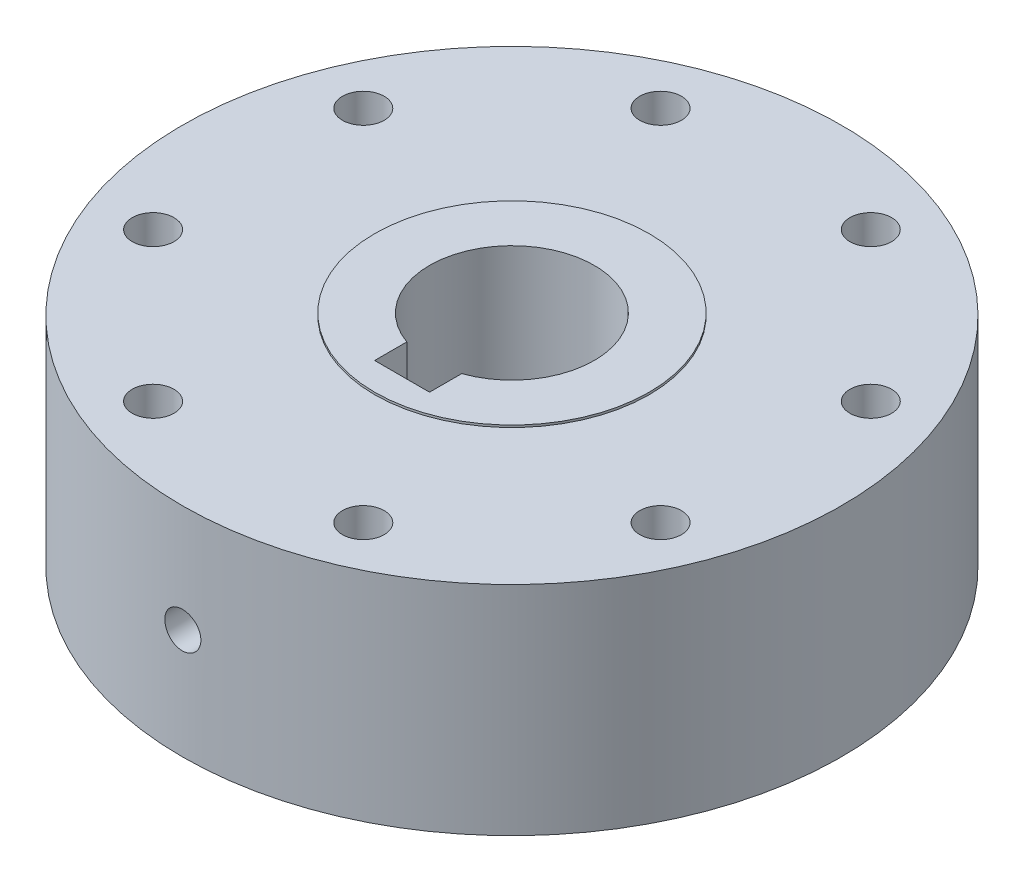
ISO-10303-21;
HEADER;
FILE_DESCRIPTION(('STEP AP214'),'2;1');
FILE_NAME('part.step','',(''),(''),'','','');
FILE_SCHEMA(('AUTOMOTIVE_DESIGN { 1 0 10303 214 1 1 1 1 }'));
ENDSEC;
DATA;
#1=APPLICATION_CONTEXT('core data for automotive mechanical design processes');
#2=APPLICATION_PROTOCOL_DEFINITION('international standard','automotive_design',2000,#1);
#3=PRODUCT_CONTEXT('',#1,'mechanical');
#4=PRODUCT('Part','Part','',(#3));
#5=PRODUCT_RELATED_PRODUCT_CATEGORY('part','',(#4));
#6=PRODUCT_DEFINITION_FORMATION('','',#4);
#7=PRODUCT_DEFINITION_CONTEXT('part definition',#1,'design');
#8=PRODUCT_DEFINITION('design','',#6,#7);
#9=PRODUCT_DEFINITION_SHAPE('','',#8);
#10=(LENGTH_UNIT() NAMED_UNIT(*) SI_UNIT(.MILLI.,.METRE.));
#11=(NAMED_UNIT(*) PLANE_ANGLE_UNIT() SI_UNIT($,.RADIAN.));
#12=(NAMED_UNIT(*) SI_UNIT($,.STERADIAN.) SOLID_ANGLE_UNIT());
#13=UNCERTAINTY_MEASURE_WITH_UNIT(LENGTH_MEASURE(1.E-05),#10,'distance_accuracy_value','');
#14=(GEOMETRIC_REPRESENTATION_CONTEXT(3) GLOBAL_UNCERTAINTY_ASSIGNED_CONTEXT((#13)) GLOBAL_UNIT_ASSIGNED_CONTEXT((#10,
#11,#12)) REPRESENTATION_CONTEXT('',''));
#15=CARTESIAN_POINT('',(0.,0.,0.));
#16=DIRECTION('',(0.,0.,1.));
#17=DIRECTION('',(1.,0.,0.));
#18=AXIS2_PLACEMENT_3D('',#15,#16,#17);
#19=CARTESIAN_POINT('',(0.,25.4,0.));
#20=DIRECTION('',(0.,1.,0.));
#21=DIRECTION('',(0.,0.,1.));
#22=AXIS2_PLACEMENT_3D('',#19,#20,#21);
#23=PLANE('',#22);
#24=DIRECTION('',(0.,0.,-1.));
#25=VECTOR('',#24,1.);
#26=CARTESIAN_POINT('',(3.175,25.4,12.7));
#27=LINE('',#26,#25);
#28=CARTESIAN_POINT('',(3.175,25.4,12.7));
#29=VERTEX_POINT('',#28);
#30=CARTESIAN_POINT('',(3.175,25.4,8.98025612106915));
#31=VERTEX_POINT('',#30);
#32=EDGE_CURVE('E98',#29,#31,#27,.T.);
#33=ORIENTED_EDGE('',*,*,#32,.F.);
#34=DIRECTION('',(1.,0.,0.));
#35=VECTOR('',#34,1.);
#36=CARTESIAN_POINT('',(-3.175,25.4,12.7));
#37=LINE('',#36,#35);
#38=CARTESIAN_POINT('',(-3.175,25.4,12.7));
#39=VERTEX_POINT('',#38);
#40=EDGE_CURVE('E94',#39,#29,#37,.T.);
#41=ORIENTED_EDGE('',*,*,#40,.F.);
#42=DIRECTION('',(0.,0.,1.));
#43=VECTOR('',#42,1.);
#44=CARTESIAN_POINT('',(-3.175,25.4,12.7));
#45=LINE('',#44,#43);
#46=CARTESIAN_POINT('',(-3.175,25.4,8.98025612106915));
#47=VERTEX_POINT('',#46);
#48=EDGE_CURVE('E77',#47,#39,#45,.T.);
#49=ORIENTED_EDGE('',*,*,#48,.F.);
#50=CARTESIAN_POINT('',(0.,25.4,0.));
#51=DIRECTION('',(0.,1.,0.));
#52=DIRECTION('',(0.,0.,1.));
#53=AXIS2_PLACEMENT_3D('',#50,#51,#52);
#54=CIRCLE('',#53,9.525);
#55=EDGE_CURVE('E128',#31,#47,#54,.T.);
#56=ORIENTED_EDGE('',*,*,#55,.F.);
#57=EDGE_LOOP('',(#33,#41,#49,#56));
#58=FACE_BOUND('',#57,.T.);
#59=CARTESIAN_POINT('',(0.,25.4,0.));
#60=DIRECTION('',(0.,1.,0.));
#61=DIRECTION('',(0.,0.,1.));
#62=AXIS2_PLACEMENT_3D('',#59,#60,#61);
#63=CIRCLE('',#62,15.875);
#64=CARTESIAN_POINT('',(0.,25.4,15.875));
#65=VERTEX_POINT('',#64);
#66=EDGE_CURVE('E248',#65,#65,#63,.T.);
#67=ORIENTED_EDGE('',*,*,#66,.T.);
#68=EDGE_LOOP('',(#67));
#69=FACE_BOUND('',#68,.T.);
#70=ADVANCED_FACE('F32',(#58,#69),#23,.T.);
#71=CARTESIAN_POINT('',(0.,25.4,0.));
#72=DIRECTION('',(0.,-1.,0.));
#73=DIRECTION('',(0.,0.,-1.));
#74=AXIS2_PLACEMENT_3D('',#71,#72,#73);
#75=CYLINDRICAL_SURFACE('',#74,38.1);
#76=CARTESIAN_POINT('',(0.,0.,0.));
#77=DIRECTION('',(0.,1.,0.));
#78=DIRECTION('',(0.,0.,1.));
#79=AXIS2_PLACEMENT_3D('',#76,#77,#78);
#80=CIRCLE('',#79,38.1);
#81=CARTESIAN_POINT('',(0.,0.,38.1));
#82=VERTEX_POINT('',#81);
#83=EDGE_CURVE('E131',#82,#82,#80,.T.);
#84=ORIENTED_EDGE('',*,*,#83,.T.);
#85=EDGE_LOOP('',(#84));
#86=FACE_BOUND('',#85,.T.);
#87=CARTESIAN_POINT('',(0.,10.6172,38.1));
#88=CARTESIAN_POINT('',(-0.116898118149773,10.6172051537948,38.0999992400124));
#89=CARTESIAN_POINT('',(-0.233878772564627,10.627074501162,38.099456242113));
#90=CARTESIAN_POINT('',(-0.464611950861902,10.666304732032,38.0973423179392));
#91=CARTESIAN_POINT('',(-0.578360523843941,10.6956884841257,38.0957701856712));
#92=CARTESIAN_POINT('',(-0.799253826201197,10.7731027867029,38.0917759009691));
#93=CARTESIAN_POINT('',(-0.906401929169276,10.8211237182805,38.0893541870776));
#94=CARTESIAN_POINT('',(-1.11108787034202,10.9344341751007,38.0839333545671));
#95=CARTESIAN_POINT('',(-1.20862794632376,10.9997196661917,38.0809343708812));
#96=CARTESIAN_POINT('',(-1.391472770554,11.1457911826273,38.0746923175143));
#97=CARTESIAN_POINT('',(-1.47676474441943,11.2265931889115,38.0714489982957));
#98=CARTESIAN_POINT('',(-1.63258321631064,11.4013717068467,38.0650859588253));
#99=CARTESIAN_POINT('',(-1.70310910642295,11.4953487606431,38.0619662436665));
#100=CARTESIAN_POINT('',(-1.82743045575922,11.6938790293206,38.0562003817822));
#101=CARTESIAN_POINT('',(-1.8812156641911,11.7984386725024,38.0535545256332));
#102=CARTESIAN_POINT('',(-1.97046319913224,12.0151208798816,38.0490378740331));
#103=CARTESIAN_POINT('',(-2.00592568479329,12.1272433783782,38.0471670718499));
#104=CARTESIAN_POINT('',(-2.05748663440265,12.3557486073612,38.0444138048177));
#105=CARTESIAN_POINT('',(-2.07360460436711,12.472126924235,38.0435303444459));
#106=CARTESIAN_POINT('',(-2.08607918802055,12.7059404117632,38.0428484021492));
#107=CARTESIAN_POINT('',(-2.08243598121361,12.823375572808,38.0430499103688));
#108=CARTESIAN_POINT('',(-2.05550785194473,13.0558364981857,38.0445142564687));
#109=CARTESIAN_POINT('',(-2.0322440154794,13.1708647132801,38.045775954973));
#110=CARTESIAN_POINT('',(-1.96676768902335,13.3953808643113,38.0492166884768));
#111=CARTESIAN_POINT('',(-1.92455510731288,13.5048687734279,38.0513957279165));
#112=CARTESIAN_POINT('',(-1.82235551875702,13.7152642229058,38.0564268709915));
#113=CARTESIAN_POINT('',(-1.76235891526367,13.8161670926582,38.0592793378533));
#114=CARTESIAN_POINT('',(-1.62630134311532,14.0064771266375,38.065335483282));
#115=CARTESIAN_POINT('',(-1.55024023772209,14.0958841930038,38.0685391648382));
#116=CARTESIAN_POINT('',(-1.38409384640786,14.2607873927191,38.0749417343897));
#117=CARTESIAN_POINT('',(-1.2939903047485,14.3362651343858,38.0781406105937));
#118=CARTESIAN_POINT('',(-1.10238085157414,14.4710253787851,38.0841690004455));
#119=CARTESIAN_POINT('',(-1.00087493688089,14.5303078770035,38.0869985139904));
#120=CARTESIAN_POINT('',(-0.789331219871679,14.6309931314684,38.0919694621865));
#121=CARTESIAN_POINT('',(-0.679293102396213,14.6723952268835,38.0941108714058));
#122=CARTESIAN_POINT('',(-0.453813402084093,14.7361323094456,38.0974639229982));
#123=CARTESIAN_POINT('',(-0.338371867574146,14.7584674670878,38.0986755736851));
#124=CARTESIAN_POINT('',(-0.105521925810008,14.7834139511654,38.1000314910098));
#125=CARTESIAN_POINT('',(0.0118837487628547,14.7860507129094,38.1001771341115));
#126=CARTESIAN_POINT('',(0.245469586830884,14.771591963014,38.0993882797459));
#127=CARTESIAN_POINT('',(0.361649755183604,14.7544965296169,38.0984537865614));
#128=CARTESIAN_POINT('',(0.589415248067528,14.7010797209736,38.0956107811925));
#129=CARTESIAN_POINT('',(0.7010033088576,14.6647699789403,38.0937028583916));
#130=CARTESIAN_POINT('',(0.916501359300316,14.5739670540551,38.0891277443874));
#131=CARTESIAN_POINT('',(1.02041129606856,14.5194737459749,38.0864605479551));
#132=CARTESIAN_POINT('',(1.21772015934398,14.3937855616492,38.0806633811317));
#133=CARTESIAN_POINT('',(1.31110822444127,14.3225736568805,38.0775329401184));
#134=CARTESIAN_POINT('',(1.48461314651072,14.1654945703459,38.071163319405));
#135=CARTESIAN_POINT('',(1.56472990257253,14.0796272771558,38.0679241388783));
#136=CARTESIAN_POINT('',(1.70950380349887,13.8955653395205,38.0616981751594));
#137=CARTESIAN_POINT('',(1.77414447616965,13.7973577284593,38.0587116630647));
#138=CARTESIAN_POINT('',(1.88601868736061,13.591468301222,38.0533320989587));
#139=CARTESIAN_POINT('',(1.93325231266649,13.4837865322843,38.0509390439885));
#140=CARTESIAN_POINT('',(2.0089429857058,13.2620662062661,38.0470181967842));
#141=CARTESIAN_POINT('',(2.03741048796101,13.148031226999,38.0454899228519));
#142=CARTESIAN_POINT('',(2.07479500277478,12.9167915779391,38.0434696312403));
#143=CARTESIAN_POINT('',(2.08371215510771,12.7995869308138,38.0429776061525));
#144=CARTESIAN_POINT('',(2.08174152727799,12.5654988462133,38.0430854778397));
#145=CARTESIAN_POINT('',(2.07087965366585,12.4486151891047,38.0436839462878));
#146=CARTESIAN_POINT('',(2.02971291184319,12.2183336723707,38.0459023361355));
#147=CARTESIAN_POINT('',(1.99940800715734,12.1049358192851,38.0475222594514));
#148=CARTESIAN_POINT('',(1.9202209558279,11.8848400309683,38.0516006579152));
#149=CARTESIAN_POINT('',(1.87133875413619,11.7781421155914,38.054059135548));
#150=CARTESIAN_POINT('',(1.75638876170778,11.5744652911815,38.0595375019407));
#151=CARTESIAN_POINT('',(1.69032146966757,11.4774861002326,38.0625573744086));
#152=CARTESIAN_POINT('',(1.54278254654911,11.2958693098962,38.0688227417525));
#153=CARTESIAN_POINT('',(1.4612925525256,11.2112466376974,38.0720685026381));
#154=CARTESIAN_POINT('',(1.2852392757015,11.0568551716993,38.078417791992));
#155=CARTESIAN_POINT('',(1.19067278782961,10.9870900301878,38.0815212853413));
#156=CARTESIAN_POINT('',(0.991065148848849,10.8643549169273,38.0872388435513));
#157=CARTESIAN_POINT('',(0.886013058533933,10.8114027313305,38.0898523889152));
#158=CARTESIAN_POINT('',(0.668573031737085,10.7239516831121,38.094288101125));
#159=CARTESIAN_POINT('',(0.556193910695684,10.689431088203,38.0961111994905));
#160=CARTESIAN_POINT('',(0.369266875454724,10.6488492898099,38.0982799332671));
#161=CARTESIAN_POINT('',(0.295928881894317,10.6369960259283,38.0989221125005));
#162=CARTESIAN_POINT('',(0.14840501519777,10.6211697490097,38.0997823869077));
#163=CARTESIAN_POINT('',(0.0742191429375544,10.6171967278324,38.1000004825196));
#164=CARTESIAN_POINT('',(0.,10.6172,38.1));
#165=B_SPLINE_CURVE_WITH_KNOTS('',3,(#87,#88,#89,#90,#91,#92,#93,#94,#95,#96,#97,#98,#99,#100,
#101,#102,#103,#104,#105,#106,#107,#108,#109,#110,#111,#112,#113,#114,#115,#116,#117,#118,#119,
#120,#121,#122,#123,#124,#125,#126,#127,#128,#129,#130,#131,#132,#133,#134,#135,#136,#137,#138,
#139,#140,#141,#142,#143,#144,#145,#146,#147,#148,#149,#150,#151,#152,#153,#154,#155,#156,#157,
#158,#159,#160,#161,#162,#163,#164),.UNSPECIFIED.,.T.,.F.,(4,2,2,2,2,2,2,2,2,2,2,2,2,2,2,2,2,2,
2,2,2,2,2,2,2,2,2,2,2,2,2,2,2,2,2,2,2,2,4),(0.,0.350423421243044,0.701258223926899,
1.0519121962006,1.40248430462873,1.75341943365593,2.10436900769498,2.45553305721007,
2.80669405645099,3.15750066467697,3.50830408629559,3.85873098441888,4.20915957877139,
4.55977761739735,4.91039864054291,5.26147934726456,5.61256015184473,5.96365393070692,
6.31474457008076,6.66538178954947,7.01601761867076,7.36644139945373,7.71686759361586,
8.06765227055999,8.41843961462447,8.76959868075505,9.1207559961006,9.47171751760667,
9.82267652992056,10.1731761870388,10.5236765016999,10.874177854969,11.224669038126,
11.5755801871279,11.9265774980185,12.2779448955653,12.6288970834253,12.8513827253459,
13.0738681374428),.UNSPECIFIED.);
#166=CARTESIAN_POINT('',(0.,10.6172,38.1));
#167=VERTEX_POINT('',#166);
#168=EDGE_CURVE('E12',#167,#167,#165,.T.);
#169=ORIENTED_EDGE('',*,*,#168,.T.);
#170=EDGE_LOOP('',(#169));
#171=FACE_BOUND('',#170,.T.);
#172=CARTESIAN_POINT('',(0.,25.146,0.));
#173=DIRECTION('',(0.,1.,0.));
#174=DIRECTION('',(0.,0.,1.));
#175=AXIS2_PLACEMENT_3D('',#172,#173,#174);
#176=CIRCLE('',#175,38.1);
#177=CARTESIAN_POINT('',(0.,25.146,38.1));
#178=VERTEX_POINT('',#177);
#179=EDGE_CURVE('E222',#178,#178,#176,.T.);
#180=ORIENTED_EDGE('',*,*,#179,.F.);
#181=EDGE_LOOP('',(#180));
#182=FACE_BOUND('',#181,.T.);
#183=ADVANCED_FACE('F34',(#86,#171,#182),#75,.T.);
#184=CARTESIAN_POINT('',(-29.3331751572334,25.4,-12.1501989775914));
#185=DIRECTION('',(0.,1.,0.));
#186=DIRECTION('',(0.,0.,1.));
#187=AXIS2_PLACEMENT_3D('',#184,#185,#186);
#188=CYLINDRICAL_SURFACE('',#187,2.41299999999999);
#189=CARTESIAN_POINT('',(-29.3331751572334,0.,-12.1501989775914));
#190=DIRECTION('',(0.,1.,0.));
#191=DIRECTION('',(0.,0.,1.));
#192=AXIS2_PLACEMENT_3D('',#189,#190,#191);
#193=CIRCLE('',#192,2.41299999999999);
#194=CARTESIAN_POINT('',(-29.3331751572334,0.,-9.73719897759141));
#195=VERTEX_POINT('',#194);
#196=EDGE_CURVE('E125',#195,#195,#193,.T.);
#197=ORIENTED_EDGE('',*,*,#196,.F.);
#198=EDGE_LOOP('',(#197));
#199=FACE_BOUND('',#198,.T.);
#200=CARTESIAN_POINT('',(-29.3331751572334,25.146,-12.1501989775914));
#201=DIRECTION('',(0.,1.,0.));
#202=DIRECTION('',(0.,0.,1.));
#203=AXIS2_PLACEMENT_3D('',#200,#201,#202);
#204=CIRCLE('',#203,2.41299999999999);
#205=CARTESIAN_POINT('',(-29.3331751572334,25.146,-9.73719897759142));
#206=VERTEX_POINT('',#205);
#207=EDGE_CURVE('E224',#206,#206,#204,.F.);
#208=ORIENTED_EDGE('',*,*,#207,.F.);
#209=EDGE_LOOP('',(#208));
#210=FACE_BOUND('',#209,.T.);
#211=ADVANCED_FACE('F184',(#199,#210),#188,.F.);
#212=CARTESIAN_POINT('',(-12.1501989775917,25.4,-29.3331751572333));
#213=DIRECTION('',(0.,1.,0.));
#214=DIRECTION('',(0.,0.,1.));
#215=AXIS2_PLACEMENT_3D('',#212,#213,#214);
#216=CYLINDRICAL_SURFACE('',#215,2.41299999999999);
#217=CARTESIAN_POINT('',(-12.1501989775917,0.,-29.3331751572333));
#218=DIRECTION('',(0.,1.,0.));
#219=DIRECTION('',(0.,0.,1.));
#220=AXIS2_PLACEMENT_3D('',#217,#218,#219);
#221=CIRCLE('',#220,2.41299999999999);
#222=CARTESIAN_POINT('',(-12.1501989775917,0.,-26.9201751572333));
#223=VERTEX_POINT('',#222);
#224=EDGE_CURVE('E122',#223,#223,#221,.T.);
#225=ORIENTED_EDGE('',*,*,#224,.F.);
#226=EDGE_LOOP('',(#225));
#227=FACE_BOUND('',#226,.T.);
#228=CARTESIAN_POINT('',(-12.1501989775917,25.146,-29.3331751572333));
#229=DIRECTION('',(0.,1.,0.));
#230=DIRECTION('',(0.,0.,1.));
#231=AXIS2_PLACEMENT_3D('',#228,#229,#230);
#232=CIRCLE('',#231,2.41299999999999);
#233=CARTESIAN_POINT('',(-12.1501989775917,25.146,-26.9201751572333));
#234=VERTEX_POINT('',#233);
#235=EDGE_CURVE('E228',#234,#234,#232,.F.);
#236=ORIENTED_EDGE('',*,*,#235,.F.);
#237=EDGE_LOOP('',(#236));
#238=FACE_BOUND('',#237,.T.);
#239=ADVANCED_FACE('F180',(#227,#238),#216,.F.);
#240=CARTESIAN_POINT('',(12.1501989775915,25.4,-29.3331751572334));
#241=DIRECTION('',(0.,1.,0.));
#242=DIRECTION('',(0.,0.,1.));
#243=AXIS2_PLACEMENT_3D('',#240,#241,#242);
#244=CYLINDRICAL_SURFACE('',#243,2.41299999999999);
#245=CARTESIAN_POINT('',(12.1501989775915,0.,-29.3331751572334));
#246=DIRECTION('',(0.,1.,0.));
#247=DIRECTION('',(0.,0.,1.));
#248=AXIS2_PLACEMENT_3D('',#245,#246,#247);
#249=CIRCLE('',#248,2.41299999999999);
#250=CARTESIAN_POINT('',(12.1501989775915,0.,-26.9201751572334));
#251=VERTEX_POINT('',#250);
#252=EDGE_CURVE('E119',#251,#251,#249,.T.);
#253=ORIENTED_EDGE('',*,*,#252,.F.);
#254=EDGE_LOOP('',(#253));
#255=FACE_BOUND('',#254,.T.);
#256=CARTESIAN_POINT('',(12.1501989775915,25.146,-29.3331751572334));
#257=DIRECTION('',(0.,1.,0.));
#258=DIRECTION('',(0.,0.,1.));
#259=AXIS2_PLACEMENT_3D('',#256,#257,#258);
#260=CIRCLE('',#259,2.41299999999999);
#261=CARTESIAN_POINT('',(12.1501989775915,25.146,-26.9201751572334));
#262=VERTEX_POINT('',#261);
#263=EDGE_CURVE('E233',#262,#262,#260,.F.);
#264=ORIENTED_EDGE('',*,*,#263,.F.);
#265=EDGE_LOOP('',(#264));
#266=FACE_BOUND('',#265,.T.);
#267=ADVANCED_FACE('F176',(#255,#266),#244,.F.);
#268=CARTESIAN_POINT('',(29.3331751572333,25.4,-12.1501989775916));
#269=DIRECTION('',(0.,1.,0.));
#270=DIRECTION('',(0.,0.,1.));
#271=AXIS2_PLACEMENT_3D('',#268,#269,#270);
#272=CYLINDRICAL_SURFACE('',#271,2.41299999999999);
#273=CARTESIAN_POINT('',(29.3331751572333,0.,-12.1501989775916));
#274=DIRECTION('',(0.,1.,0.));
#275=DIRECTION('',(0.,0.,1.));
#276=AXIS2_PLACEMENT_3D('',#273,#274,#275);
#277=CIRCLE('',#276,2.41299999999999);
#278=CARTESIAN_POINT('',(29.3331751572333,0.,-9.73719897759164));
#279=VERTEX_POINT('',#278);
#280=EDGE_CURVE('E116',#279,#279,#277,.T.);
#281=ORIENTED_EDGE('',*,*,#280,.F.);
#282=EDGE_LOOP('',(#281));
#283=FACE_BOUND('',#282,.T.);
#284=CARTESIAN_POINT('',(29.3331751572333,25.146,-12.1501989775916));
#285=DIRECTION('',(0.,1.,0.));
#286=DIRECTION('',(0.,0.,1.));
#287=AXIS2_PLACEMENT_3D('',#284,#285,#286);
#288=CIRCLE('',#287,2.41299999999999);
#289=CARTESIAN_POINT('',(29.3331751572333,25.146,-9.73719897759164));
#290=VERTEX_POINT('',#289);
#291=EDGE_CURVE('E236',#290,#290,#288,.F.);
#292=ORIENTED_EDGE('',*,*,#291,.F.);
#293=EDGE_LOOP('',(#292));
#294=FACE_BOUND('',#293,.T.);
#295=ADVANCED_FACE('F172',(#283,#294),#272,.F.);
#296=CARTESIAN_POINT('',(29.3331751572334,25.4,12.1501989775914));
#297=DIRECTION('',(0.,1.,0.));
#298=DIRECTION('',(0.,0.,1.));
#299=AXIS2_PLACEMENT_3D('',#296,#297,#298);
#300=CYLINDRICAL_SURFACE('',#299,2.41299999999999);
#301=CARTESIAN_POINT('',(29.3331751572334,0.,12.1501989775914));
#302=DIRECTION('',(0.,1.,0.));
#303=DIRECTION('',(0.,0.,1.));
#304=AXIS2_PLACEMENT_3D('',#301,#302,#303);
#305=CIRCLE('',#304,2.41299999999999);
#306=CARTESIAN_POINT('',(29.3331751572334,0.,14.5631989775914));
#307=VERTEX_POINT('',#306);
#308=EDGE_CURVE('E113',#307,#307,#305,.T.);
#309=ORIENTED_EDGE('',*,*,#308,.F.);
#310=EDGE_LOOP('',(#309));
#311=FACE_BOUND('',#310,.T.);
#312=CARTESIAN_POINT('',(29.3331751572334,25.146,12.1501989775914));
#313=DIRECTION('',(0.,1.,0.));
#314=DIRECTION('',(0.,0.,1.));
#315=AXIS2_PLACEMENT_3D('',#312,#313,#314);
#316=CIRCLE('',#315,2.41299999999999);
#317=CARTESIAN_POINT('',(29.3331751572334,25.146,14.5631989775914));
#318=VERTEX_POINT('',#317);
#319=EDGE_CURVE('E239',#318,#318,#316,.F.);
#320=ORIENTED_EDGE('',*,*,#319,.F.);
#321=EDGE_LOOP('',(#320));
#322=FACE_BOUND('',#321,.T.);
#323=ADVANCED_FACE('F168',(#311,#322),#300,.F.);
#324=CARTESIAN_POINT('',(12.1501989775915,25.4,29.3331751572334));
#325=DIRECTION('',(0.,1.,0.));
#326=DIRECTION('',(0.,0.,1.));
#327=AXIS2_PLACEMENT_3D('',#324,#325,#326);
#328=CYLINDRICAL_SURFACE('',#327,2.41299999999999);
#329=CARTESIAN_POINT('',(12.1501989775915,0.,29.3331751572334));
#330=DIRECTION('',(0.,1.,0.));
#331=DIRECTION('',(0.,0.,1.));
#332=AXIS2_PLACEMENT_3D('',#329,#330,#331);
#333=CIRCLE('',#332,2.41299999999999);
#334=CARTESIAN_POINT('',(12.1501989775915,0.,31.7461751572334));
#335=VERTEX_POINT('',#334);
#336=EDGE_CURVE('E110',#335,#335,#333,.T.);
#337=ORIENTED_EDGE('',*,*,#336,.F.);
#338=EDGE_LOOP('',(#337));
#339=FACE_BOUND('',#338,.T.);
#340=CARTESIAN_POINT('',(12.1501989775915,25.146,29.3331751572334));
#341=DIRECTION('',(0.,1.,0.));
#342=DIRECTION('',(0.,0.,1.));
#343=AXIS2_PLACEMENT_3D('',#340,#341,#342);
#344=CIRCLE('',#343,2.41299999999999);
#345=CARTESIAN_POINT('',(12.1501989775915,25.146,31.7461751572334));
#346=VERTEX_POINT('',#345);
#347=EDGE_CURVE('E242',#346,#346,#344,.F.);
#348=ORIENTED_EDGE('',*,*,#347,.F.);
#349=EDGE_LOOP('',(#348));
#350=FACE_BOUND('',#349,.T.);
#351=ADVANCED_FACE('F164',(#339,#350),#328,.F.);
#352=CARTESIAN_POINT('',(-12.1501989775917,25.4,29.3331751572333));
#353=DIRECTION('',(0.,1.,0.));
#354=DIRECTION('',(0.,0.,1.));
#355=AXIS2_PLACEMENT_3D('',#352,#353,#354);
#356=CYLINDRICAL_SURFACE('',#355,2.41299999999999);
#357=CARTESIAN_POINT('',(-12.1501989775917,0.,29.3331751572333));
#358=DIRECTION('',(0.,1.,0.));
#359=DIRECTION('',(0.,0.,1.));
#360=AXIS2_PLACEMENT_3D('',#357,#358,#359);
#361=CIRCLE('',#360,2.41299999999999);
#362=CARTESIAN_POINT('',(-12.1501989775917,0.,31.7461751572333));
#363=VERTEX_POINT('',#362);
#364=EDGE_CURVE('E107',#363,#363,#361,.T.);
#365=ORIENTED_EDGE('',*,*,#364,.F.);
#366=EDGE_LOOP('',(#365));
#367=FACE_BOUND('',#366,.T.);
#368=CARTESIAN_POINT('',(-12.1501989775917,25.146,29.3331751572333));
#369=DIRECTION('',(0.,1.,0.));
#370=DIRECTION('',(0.,0.,1.));
#371=AXIS2_PLACEMENT_3D('',#368,#369,#370);
#372=CIRCLE('',#371,2.41299999999999);
#373=CARTESIAN_POINT('',(-12.1501989775917,25.146,31.7461751572333));
#374=VERTEX_POINT('',#373);
#375=EDGE_CURVE('E245',#374,#374,#372,.F.);
#376=ORIENTED_EDGE('',*,*,#375,.F.);
#377=EDGE_LOOP('',(#376));
#378=FACE_BOUND('',#377,.T.);
#379=ADVANCED_FACE('F160',(#367,#378),#356,.F.);
#380=CARTESIAN_POINT('',(-29.3331751572334,25.4,12.1501989775914));
#381=DIRECTION('',(0.,1.,0.));
#382=DIRECTION('',(0.,0.,1.));
#383=AXIS2_PLACEMENT_3D('',#380,#381,#382);
#384=CYLINDRICAL_SURFACE('',#383,2.41299999999999);
#385=CARTESIAN_POINT('',(-29.3331751572334,0.,12.1501989775914));
#386=DIRECTION('',(0.,1.,0.));
#387=DIRECTION('',(0.,0.,1.));
#388=AXIS2_PLACEMENT_3D('',#385,#386,#387);
#389=CIRCLE('',#388,2.41299999999999);
#390=CARTESIAN_POINT('',(-29.3331751572334,0.,14.5631989775914));
#391=VERTEX_POINT('',#390);
#392=EDGE_CURVE('E103',#391,#391,#389,.T.);
#393=ORIENTED_EDGE('',*,*,#392,.F.);
#394=EDGE_LOOP('',(#393));
#395=FACE_BOUND('',#394,.T.);
#396=CARTESIAN_POINT('',(-29.3331751572334,25.146,12.1501989775914));
#397=DIRECTION('',(0.,1.,0.));
#398=DIRECTION('',(0.,0.,1.));
#399=AXIS2_PLACEMENT_3D('',#396,#397,#398);
#400=CIRCLE('',#399,2.41299999999999);
#401=CARTESIAN_POINT('',(-29.3331751572334,25.146,14.5631989775914));
#402=VERTEX_POINT('',#401);
#403=EDGE_CURVE('E37',#402,#402,#400,.F.);
#404=ORIENTED_EDGE('',*,*,#403,.F.);
#405=EDGE_LOOP('',(#404));
#406=FACE_BOUND('',#405,.T.);
#407=ADVANCED_FACE('F157',(#395,#406),#384,.F.);
#408=CARTESIAN_POINT('',(0.,0.,0.));
#409=DIRECTION('',(0.,1.,0.));
#410=DIRECTION('',(0.,0.,1.));
#411=AXIS2_PLACEMENT_3D('',#408,#409,#410);
#412=PLANE('',#411);
#413=ORIENTED_EDGE('',*,*,#392,.T.);
#414=EDGE_LOOP('',(#413));
#415=FACE_BOUND('',#414,.T.);
#416=ORIENTED_EDGE('',*,*,#364,.T.);
#417=EDGE_LOOP('',(#416));
#418=FACE_BOUND('',#417,.T.);
#419=ORIENTED_EDGE('',*,*,#336,.T.);
#420=EDGE_LOOP('',(#419));
#421=FACE_BOUND('',#420,.T.);
#422=ORIENTED_EDGE('',*,*,#308,.T.);
#423=EDGE_LOOP('',(#422));
#424=FACE_BOUND('',#423,.T.);
#425=ORIENTED_EDGE('',*,*,#280,.T.);
#426=EDGE_LOOP('',(#425));
#427=FACE_BOUND('',#426,.T.);
#428=ORIENTED_EDGE('',*,*,#252,.T.);
#429=EDGE_LOOP('',(#428));
#430=FACE_BOUND('',#429,.T.);
#431=ORIENTED_EDGE('',*,*,#224,.T.);
#432=EDGE_LOOP('',(#431));
#433=FACE_BOUND('',#432,.T.);
#434=ORIENTED_EDGE('',*,*,#196,.T.);
#435=EDGE_LOOP('',(#434));
#436=FACE_BOUND('',#435,.T.);
#437=ORIENTED_EDGE('',*,*,#83,.F.);
#438=EDGE_LOOP('',(#437));
#439=FACE_BOUND('',#438,.T.);
#440=DIRECTION('',(1.,0.,0.));
#441=VECTOR('',#440,1.);
#442=CARTESIAN_POINT('',(-3.175,0.,12.7));
#443=LINE('',#442,#441);
#444=CARTESIAN_POINT('',(-3.175,0.,12.7));
#445=VERTEX_POINT('',#444);
#446=CARTESIAN_POINT('',(3.175,0.,12.7));
#447=VERTEX_POINT('',#446);
#448=EDGE_CURVE('E82',#445,#447,#443,.T.);
#449=ORIENTED_EDGE('',*,*,#448,.T.);
#450=DIRECTION('',(0.,0.,-1.));
#451=VECTOR('',#450,1.);
#452=CARTESIAN_POINT('',(3.175,0.,12.7));
#453=LINE('',#452,#451);
#454=CARTESIAN_POINT('',(3.175,0.,8.98025612106915));
#455=VERTEX_POINT('',#454);
#456=EDGE_CURVE('E92',#447,#455,#453,.T.);
#457=ORIENTED_EDGE('',*,*,#456,.T.);
#458=CARTESIAN_POINT('',(0.,0.,0.));
#459=DIRECTION('',(0.,1.,0.));
#460=DIRECTION('',(0.,0.,1.));
#461=AXIS2_PLACEMENT_3D('',#458,#459,#460);
#462=CIRCLE('',#461,9.525);
#463=CARTESIAN_POINT('',(-3.175,0.,8.98025612106915));
#464=VERTEX_POINT('',#463);
#465=EDGE_CURVE('E91',#455,#464,#462,.T.);
#466=ORIENTED_EDGE('',*,*,#465,.T.);
#467=DIRECTION('',(0.,0.,1.));
#468=VECTOR('',#467,1.);
#469=CARTESIAN_POINT('',(-3.175,0.,12.7));
#470=LINE('',#469,#468);
#471=EDGE_CURVE('E49',#464,#445,#470,.T.);
#472=ORIENTED_EDGE('',*,*,#471,.T.);
#473=EDGE_LOOP('',(#449,#457,#466,#472));
#474=FACE_BOUND('',#473,.T.);
#475=ADVANCED_FACE('F89',(#415,#418,#421,#424,#427,#430,#433,#436,#439,#474),#412,.F.);
#476=CARTESIAN_POINT('',(0.,25.4,0.));
#477=DIRECTION('',(0.,-1.,0.));
#478=DIRECTION('',(0.,0.,-1.));
#479=AXIS2_PLACEMENT_3D('',#476,#477,#478);
#480=CYLINDRICAL_SURFACE('',#479,9.525);
#481=DIRECTION('',(0.,-1.,0.));
#482=VECTOR('',#481,1.);
#483=CARTESIAN_POINT('',(3.175,25.4,8.98025612106915));
#484=LINE('',#483,#482);
#485=EDGE_CURVE('E42',#31,#455,#484,.T.);
#486=ORIENTED_EDGE('',*,*,#485,.F.);
#487=ORIENTED_EDGE('',*,*,#55,.T.);
#488=DIRECTION('',(0.,-1.,0.));
#489=VECTOR('',#488,1.);
#490=CARTESIAN_POINT('',(-3.175,25.4,8.98025612106915));
#491=LINE('',#490,#489);
#492=EDGE_CURVE('E135',#464,#47,#491,.F.);
#493=ORIENTED_EDGE('',*,*,#492,.F.);
#494=ORIENTED_EDGE('',*,*,#465,.F.);
#495=EDGE_LOOP('',(#486,#487,#493,#494));
#496=FACE_BOUND('',#495,.T.);
#497=ADVANCED_FACE('F156',(#496),#480,.F.);
#498=CARTESIAN_POINT('',(3.175,0.,12.7));
#499=DIRECTION('',(1.,0.,0.));
#500=DIRECTION('',(0.,0.,-1.));
#501=AXIS2_PLACEMENT_3D('',#498,#499,#500);
#502=PLANE('',#501);
#503=ORIENTED_EDGE('',*,*,#485,.T.);
#504=ORIENTED_EDGE('',*,*,#456,.F.);
#505=DIRECTION('',(0.,1.,0.));
#506=VECTOR('',#505,1.);
#507=CARTESIAN_POINT('',(3.175,0.,12.7));
#508=LINE('',#507,#506);
#509=EDGE_CURVE('E81',#447,#29,#508,.T.);
#510=ORIENTED_EDGE('',*,*,#509,.T.);
#511=ORIENTED_EDGE('',*,*,#32,.T.);
#512=EDGE_LOOP('',(#503,#504,#510,#511));
#513=FACE_BOUND('',#512,.T.);
#514=ADVANCED_FACE('F150',(#513),#502,.F.);
#515=CARTESIAN_POINT('',(-3.175,0.,12.7));
#516=DIRECTION('',(0.,0.,1.));
#517=DIRECTION('',(1.,0.,0.));
#518=AXIS2_PLACEMENT_3D('',#515,#516,#517);
#519=PLANE('',#518);
#520=CARTESIAN_POINT('',(0.,12.7,12.7));
#521=DIRECTION('',(0.,0.,-1.));
#522=DIRECTION('',(-1.,0.,0.));
#523=AXIS2_PLACEMENT_3D('',#520,#521,#522);
#524=CIRCLE('',#523,2.08279999999999);
#525=CARTESIAN_POINT('',(-2.08279999999999,12.7,12.7));
#526=VERTEX_POINT('',#525);
#527=EDGE_CURVE('E100',#526,#526,#524,.T.);
#528=ORIENTED_EDGE('',*,*,#527,.F.);
#529=EDGE_LOOP('',(#528));
#530=FACE_BOUND('',#529,.T.);
#531=ORIENTED_EDGE('',*,*,#40,.T.);
#532=ORIENTED_EDGE('',*,*,#509,.F.);
#533=ORIENTED_EDGE('',*,*,#448,.F.);
#534=DIRECTION('',(0.,1.,0.));
#535=VECTOR('',#534,1.);
#536=CARTESIAN_POINT('',(-3.175,0.,12.7));
#537=LINE('',#536,#535);
#538=EDGE_CURVE('E73',#445,#39,#537,.T.);
#539=ORIENTED_EDGE('',*,*,#538,.T.);
#540=EDGE_LOOP('',(#531,#532,#533,#539));
#541=FACE_BOUND('',#540,.T.);
#542=ADVANCED_FACE('F85',(#530,#541),#519,.F.);
#543=CARTESIAN_POINT('',(-3.175,0.,12.7));
#544=DIRECTION('',(-1.,0.,0.));
#545=DIRECTION('',(0.,0.,1.));
#546=AXIS2_PLACEMENT_3D('',#543,#544,#545);
#547=PLANE('',#546);
#548=ORIENTED_EDGE('',*,*,#492,.T.);
#549=ORIENTED_EDGE('',*,*,#48,.T.);
#550=ORIENTED_EDGE('',*,*,#538,.F.);
#551=ORIENTED_EDGE('',*,*,#471,.F.);
#552=EDGE_LOOP('',(#548,#549,#550,#551));
#553=FACE_BOUND('',#552,.T.);
#554=ADVANCED_FACE('F75',(#553),#547,.F.);
#555=CARTESIAN_POINT('',(0.,12.7,12.7));
#556=DIRECTION('',(0.,0.,-1.));
#557=DIRECTION('',(-1.,0.,0.));
#558=AXIS2_PLACEMENT_3D('',#555,#556,#557);
#559=CYLINDRICAL_SURFACE('',#558,2.08279999999999);
#560=ORIENTED_EDGE('',*,*,#527,.T.);
#561=EDGE_LOOP('',(#560));
#562=FACE_BOUND('',#561,.T.);
#563=ORIENTED_EDGE('',*,*,#168,.F.);
#564=EDGE_LOOP('',(#563));
#565=FACE_BOUND('',#564,.T.);
#566=ADVANCED_FACE('F140',(#562,#565),#559,.F.);
#567=CARTESIAN_POINT('',(0.,25.146,0.));
#568=DIRECTION('',(0.,1.,0.));
#569=DIRECTION('',(0.,0.,1.));
#570=AXIS2_PLACEMENT_3D('',#567,#568,#569);
#571=PLANE('',#570);
#572=ORIENTED_EDGE('',*,*,#207,.T.);
#573=EDGE_LOOP('',(#572));
#574=FACE_BOUND('',#573,.T.);
#575=ORIENTED_EDGE('',*,*,#263,.T.);
#576=EDGE_LOOP('',(#575));
#577=FACE_BOUND('',#576,.T.);
#578=ORIENTED_EDGE('',*,*,#319,.T.);
#579=EDGE_LOOP('',(#578));
#580=FACE_BOUND('',#579,.T.);
#581=ORIENTED_EDGE('',*,*,#375,.T.);
#582=EDGE_LOOP('',(#581));
#583=FACE_BOUND('',#582,.T.);
#584=CARTESIAN_POINT('',(0.,25.146,0.));
#585=DIRECTION('',(0.,1.,0.));
#586=DIRECTION('',(0.,0.,1.));
#587=AXIS2_PLACEMENT_3D('',#584,#585,#586);
#588=CIRCLE('',#587,15.875);
#589=CARTESIAN_POINT('',(0.,25.146,15.875));
#590=VERTEX_POINT('',#589);
#591=EDGE_CURVE('E251',#590,#590,#588,.T.);
#592=ORIENTED_EDGE('',*,*,#591,.F.);
#593=EDGE_LOOP('',(#592));
#594=FACE_BOUND('',#593,.T.);
#595=ORIENTED_EDGE('',*,*,#403,.T.);
#596=EDGE_LOOP('',(#595));
#597=FACE_BOUND('',#596,.T.);
#598=ORIENTED_EDGE('',*,*,#347,.T.);
#599=EDGE_LOOP('',(#598));
#600=FACE_BOUND('',#599,.T.);
#601=ORIENTED_EDGE('',*,*,#291,.T.);
#602=EDGE_LOOP('',(#601));
#603=FACE_BOUND('',#602,.T.);
#604=ORIENTED_EDGE('',*,*,#235,.T.);
#605=EDGE_LOOP('',(#604));
#606=FACE_BOUND('',#605,.T.);
#607=ORIENTED_EDGE('',*,*,#179,.T.);
#608=EDGE_LOOP('',(#607));
#609=FACE_BOUND('',#608,.T.);
#610=ADVANCED_FACE('F145',(#574,#577,#580,#583,#594,#597,#600,#603,#606,#609),#571,.T.);
#611=CARTESIAN_POINT('',(0.,25.146,0.));
#612=DIRECTION('',(0.,1.,0.));
#613=DIRECTION('',(0.,0.,1.));
#614=AXIS2_PLACEMENT_3D('',#611,#612,#613);
#615=CYLINDRICAL_SURFACE('',#614,15.875);
#616=ORIENTED_EDGE('',*,*,#591,.T.);
#617=EDGE_LOOP('',(#616));
#618=FACE_BOUND('',#617,.T.);
#619=ORIENTED_EDGE('',*,*,#66,.F.);
#620=EDGE_LOOP('',(#619));
#621=FACE_BOUND('',#620,.T.);
#622=ADVANCED_FACE('F261',(#618,#621),#615,.T.);
#623=CLOSED_SHELL('',(#70,#183,#211,#239,#267,#295,#323,#351,#379,#407,#475,#497,#514,#542,#554,
#566,#610,#622));
#624=MANIFOLD_SOLID_BREP('B2',#623);
#625=ADVANCED_BREP_SHAPE_REPRESENTATION('',(#18,#624),#14);
#626=SHAPE_DEFINITION_REPRESENTATION(#9,#625);
ENDSEC;
END-ISO-10303-21;
